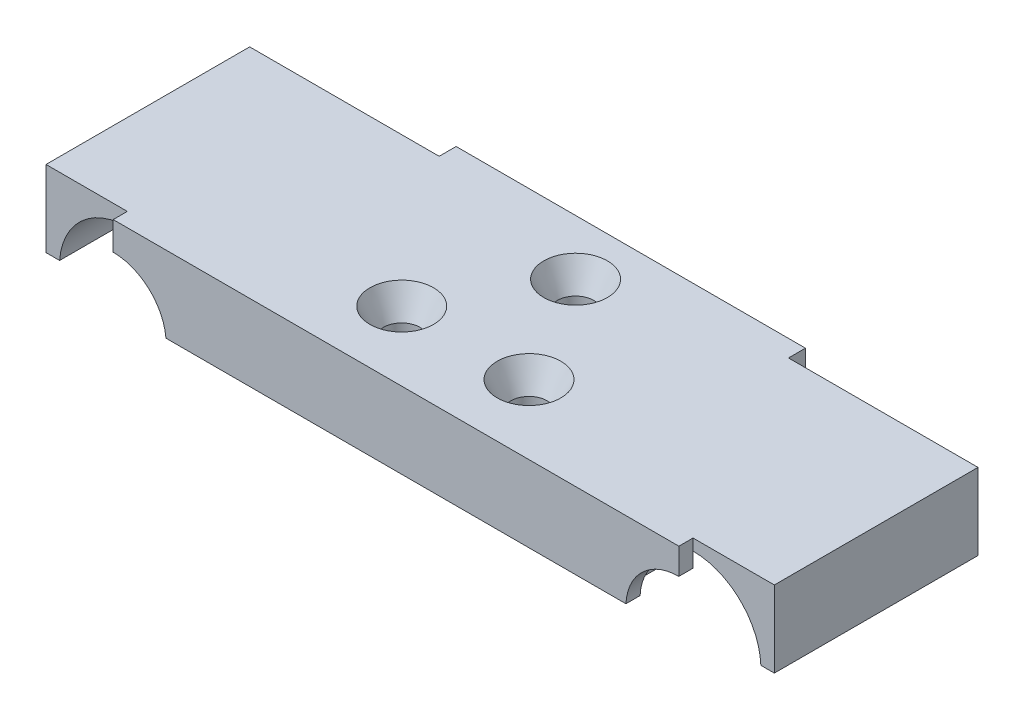
ISO-10303-21;
HEADER;
FILE_DESCRIPTION(('STEP AP214'),'2;1');
FILE_NAME('part.step','',(''),(''),'','','');
FILE_SCHEMA(('AUTOMOTIVE_DESIGN { 1 0 10303 214 1 1 1 1 }'));
ENDSEC;
DATA;
#1=APPLICATION_CONTEXT('core data for automotive mechanical design processes');
#2=APPLICATION_PROTOCOL_DEFINITION('international standard','automotive_design',2000,#1);
#3=PRODUCT_CONTEXT('',#1,'mechanical');
#4=PRODUCT('Part','Part','',(#3));
#5=PRODUCT_RELATED_PRODUCT_CATEGORY('part','',(#4));
#6=PRODUCT_DEFINITION_FORMATION('','',#4);
#7=PRODUCT_DEFINITION_CONTEXT('part definition',#1,'design');
#8=PRODUCT_DEFINITION('design','',#6,#7);
#9=PRODUCT_DEFINITION_SHAPE('','',#8);
#10=(LENGTH_UNIT() NAMED_UNIT(*) SI_UNIT(.MILLI.,.METRE.));
#11=(NAMED_UNIT(*) PLANE_ANGLE_UNIT() SI_UNIT($,.RADIAN.));
#12=(NAMED_UNIT(*) SI_UNIT($,.STERADIAN.) SOLID_ANGLE_UNIT());
#13=UNCERTAINTY_MEASURE_WITH_UNIT(LENGTH_MEASURE(1.E-05),#10,'distance_accuracy_value','');
#14=(GEOMETRIC_REPRESENTATION_CONTEXT(3) GLOBAL_UNCERTAINTY_ASSIGNED_CONTEXT((#13)) GLOBAL_UNIT_ASSIGNED_CONTEXT((#10,
#11,#12)) REPRESENTATION_CONTEXT('',''));
#15=CARTESIAN_POINT('',(0.,0.,0.));
#16=DIRECTION('',(0.,0.,1.));
#17=DIRECTION('',(1.,0.,0.));
#18=AXIS2_PLACEMENT_3D('',#15,#16,#17);
#19=CARTESIAN_POINT('',(32.7025,7.112,0.));
#20=DIRECTION('',(0.,0.,-1.));
#21=DIRECTION('',(-1.,0.,0.));
#22=AXIS2_PLACEMENT_3D('',#19,#20,#21);
#23=PLANE('',#22);
#24=DIRECTION('',(0.,-1.,0.));
#25=VECTOR('',#24,1.);
#26=CARTESIAN_POINT('',(-32.7025,7.112,0.));
#27=LINE('',#26,#25);
#28=CARTESIAN_POINT('',(-32.7025,7.112,0.));
#29=VERTEX_POINT('',#28);
#30=CARTESIAN_POINT('',(-32.7025,0.254,0.));
#31=VERTEX_POINT('',#30);
#32=EDGE_CURVE('E231',#29,#31,#27,.T.);
#33=ORIENTED_EDGE('',*,*,#32,.T.);
#34=DIRECTION('',(1.,0.,0.));
#35=VECTOR('',#34,1.);
#36=CARTESIAN_POINT('',(32.7025,0.254,0.));
#37=LINE('',#36,#35);
#38=CARTESIAN_POINT('',(-31.4797726725594,0.254,0.));
#39=VERTEX_POINT('',#38);
#40=EDGE_CURVE('E281',#31,#39,#37,.T.);
#41=ORIENTED_EDGE('',*,*,#40,.T.);
#42=CARTESIAN_POINT('',(-25.4,-0.190499999999999,0.));
#43=DIRECTION('',(0.,0.,1.));
#44=DIRECTION('',(1.,0.,0.));
#45=AXIS2_PLACEMENT_3D('',#42,#43,#44);
#46=CIRCLE('',#45,6.096);
#47=CARTESIAN_POINT('',(-25.4,5.9055,0.));
#48=VERTEX_POINT('',#47);
#49=EDGE_CURVE('E401',#48,#39,#46,.T.);
#50=ORIENTED_EDGE('',*,*,#49,.F.);
#51=DIRECTION('',(0.,-1.,0.));
#52=VECTOR('',#51,1.);
#53=CARTESIAN_POINT('',(-25.4,4.572,0.));
#54=LINE('',#53,#52);
#55=CARTESIAN_POINT('',(-25.4,7.112,0.));
#56=VERTEX_POINT('',#55);
#57=EDGE_CURVE('E365',#56,#48,#54,.T.);
#58=ORIENTED_EDGE('',*,*,#57,.F.);
#59=DIRECTION('',(1.,0.,0.));
#60=VECTOR('',#59,1.);
#61=CARTESIAN_POINT('',(32.7025,7.112,0.));
#62=LINE('',#61,#60);
#63=EDGE_CURVE('E243',#29,#56,#62,.T.);
#64=ORIENTED_EDGE('',*,*,#63,.F.);
#65=EDGE_LOOP('',(#33,#41,#50,#58,#64));
#66=FACE_BOUND('',#65,.T.);
#67=ADVANCED_FACE('F32',(#66),#23,.F.);
#68=CARTESIAN_POINT('',(25.3996428112442,0.,0.));
#69=DIRECTION('',(0.,0.,1.));
#70=DIRECTION('',(1.,0.,0.));
#71=AXIS2_PLACEMENT_3D('',#68,#69,#70);
#72=CIRCLE('',#71,6.096);
#73=CARTESIAN_POINT('',(31.4903488458514,0.254,0.));
#74=VERTEX_POINT('',#73);
#75=CARTESIAN_POINT('',(25.3996428112442,6.096,0.));
#76=VERTEX_POINT('',#75);
#77=EDGE_CURVE('E349',#74,#76,#72,.T.);
#78=ORIENTED_EDGE('',*,*,#77,.F.);
#79=DIRECTION('',(1.,0.,0.));
#80=VECTOR('',#79,1.);
#81=CARTESIAN_POINT('',(32.7025,0.254,0.));
#82=LINE('',#81,#80);
#83=CARTESIAN_POINT('',(32.7025,0.254,0.));
#84=VERTEX_POINT('',#83);
#85=EDGE_CURVE('E348',#74,#84,#82,.T.);
#86=ORIENTED_EDGE('',*,*,#85,.T.);
#87=DIRECTION('',(0.,-1.,0.));
#88=VECTOR('',#87,1.);
#89=CARTESIAN_POINT('',(32.7025,7.112,0.));
#90=LINE('',#89,#88);
#91=CARTESIAN_POINT('',(32.7025,7.112,0.));
#92=VERTEX_POINT('',#91);
#93=EDGE_CURVE('E228',#92,#84,#90,.T.);
#94=ORIENTED_EDGE('',*,*,#93,.F.);
#95=CARTESIAN_POINT('',(25.3996428112442,7.112,0.));
#96=VERTEX_POINT('',#95);
#97=EDGE_CURVE('E248',#96,#92,#62,.T.);
#98=ORIENTED_EDGE('',*,*,#97,.F.);
#99=DIRECTION('',(0.,1.,0.));
#100=VECTOR('',#99,1.);
#101=CARTESIAN_POINT('',(25.3996428112442,4.7625,0.));
#102=LINE('',#101,#100);
#103=EDGE_CURVE('E42',#76,#96,#102,.T.);
#104=ORIENTED_EDGE('',*,*,#103,.F.);
#105=EDGE_LOOP('',(#78,#86,#94,#98,#104));
#106=FACE_BOUND('',#105,.T.);
#107=ADVANCED_FACE('F347',(#106),#23,.F.);
#108=CARTESIAN_POINT('',(25.3996428112442,0.,-19.812));
#109=DIRECTION('',(0.,0.,1.));
#110=DIRECTION('',(1.,0.,0.));
#111=AXIS2_PLACEMENT_3D('',#108,#109,#110);
#112=CYLINDRICAL_SURFACE('',#111,4.7625);
#113=CARTESIAN_POINT('',(25.3996428112442,0.,-10.668));
#114=DIRECTION('',(0.,0.,1.));
#115=DIRECTION('',(1.,0.,0.));
#116=AXIS2_PLACEMENT_3D('',#113,#114,#115);
#117=CIRCLE('',#116,4.7625);
#118=CARTESIAN_POINT('',(20.6439209680326,0.254,-10.668));
#119=VERTEX_POINT('',#118);
#120=CARTESIAN_POINT('',(30.1553646544558,0.254,-10.668));
#121=VERTEX_POINT('',#120);
#122=EDGE_CURVE('E240',#119,#121,#117,.F.);
#123=ORIENTED_EDGE('',*,*,#122,.F.);
#124=DIRECTION('',(0.,0.,1.));
#125=VECTOR('',#124,1.);
#126=CARTESIAN_POINT('',(20.6439209680326,0.254,-19.812));
#127=LINE('',#126,#125);
#128=CARTESIAN_POINT('',(20.6439209680326,0.254,-18.288));
#129=VERTEX_POINT('',#128);
#130=EDGE_CURVE('E289',#119,#129,#127,.F.);
#131=ORIENTED_EDGE('',*,*,#130,.T.);
#132=CARTESIAN_POINT('',(25.3996428112442,0.,-18.288));
#133=DIRECTION('',(0.,0.,1.));
#134=DIRECTION('',(1.,0.,0.));
#135=AXIS2_PLACEMENT_3D('',#132,#133,#134);
#136=CIRCLE('',#135,4.7625);
#137=CARTESIAN_POINT('',(30.1553646544558,0.254,-18.288));
#138=VERTEX_POINT('',#137);
#139=EDGE_CURVE('E234',#138,#129,#136,.T.);
#140=ORIENTED_EDGE('',*,*,#139,.F.);
#141=DIRECTION('',(0.,0.,1.));
#142=VECTOR('',#141,1.);
#143=CARTESIAN_POINT('',(30.1553646544558,0.254,-19.812));
#144=LINE('',#143,#142);
#145=EDGE_CURVE('E350',#138,#121,#144,.T.);
#146=ORIENTED_EDGE('',*,*,#145,.T.);
#147=EDGE_LOOP('',(#123,#131,#140,#146));
#148=FACE_BOUND('',#147,.T.);
#149=ADVANCED_FACE('F433',(#148),#112,.F.);
#150=CARTESIAN_POINT('',(-25.4,-0.190499999999999,-19.812));
#151=DIRECTION('',(0.,0.,1.));
#152=DIRECTION('',(1.,0.,0.));
#153=AXIS2_PLACEMENT_3D('',#150,#151,#152);
#154=CYLINDRICAL_SURFACE('',#153,4.7625);
#155=CARTESIAN_POINT('',(-25.4,-0.190499999999999,-10.668));
#156=DIRECTION('',(0.,0.,1.));
#157=DIRECTION('',(1.,0.,0.));
#158=AXIS2_PLACEMENT_3D('',#155,#156,#157);
#159=CIRCLE('',#158,4.7625);
#160=CARTESIAN_POINT('',(-30.141711294459,0.254,-10.668));
#161=VERTEX_POINT('',#160);
#162=CARTESIAN_POINT('',(-20.658288705541,0.254,-10.668));
#163=VERTEX_POINT('',#162);
#164=EDGE_CURVE('E237',#161,#163,#159,.F.);
#165=ORIENTED_EDGE('',*,*,#164,.F.);
#166=DIRECTION('',(0.,0.,1.));
#167=VECTOR('',#166,1.);
#168=CARTESIAN_POINT('',(-30.141711294459,0.254,-19.812));
#169=LINE('',#168,#167);
#170=CARTESIAN_POINT('',(-30.141711294459,0.254,-18.288));
#171=VERTEX_POINT('',#170);
#172=EDGE_CURVE('E49',#161,#171,#169,.F.);
#173=ORIENTED_EDGE('',*,*,#172,.T.);
#174=CARTESIAN_POINT('',(-25.4,-0.190499999999999,-18.288));
#175=DIRECTION('',(0.,0.,1.));
#176=DIRECTION('',(1.,0.,0.));
#177=AXIS2_PLACEMENT_3D('',#174,#175,#176);
#178=CIRCLE('',#177,4.7625);
#179=CARTESIAN_POINT('',(-20.658288705541,0.254,-18.288));
#180=VERTEX_POINT('',#179);
#181=EDGE_CURVE('E279',#180,#171,#178,.T.);
#182=ORIENTED_EDGE('',*,*,#181,.F.);
#183=DIRECTION('',(0.,0.,1.));
#184=VECTOR('',#183,1.);
#185=CARTESIAN_POINT('',(-20.658288705541,0.254,-19.812));
#186=LINE('',#185,#184);
#187=EDGE_CURVE('E291',#180,#163,#186,.T.);
#188=ORIENTED_EDGE('',*,*,#187,.T.);
#189=EDGE_LOOP('',(#165,#173,#182,#188));
#190=FACE_BOUND('',#189,.T.);
#191=ADVANCED_FACE('F431',(#190),#154,.F.);
#192=CARTESIAN_POINT('',(-32.7025,7.112,0.));
#193=DIRECTION('',(1.,0.,0.));
#194=DIRECTION('',(0.,0.,-1.));
#195=AXIS2_PLACEMENT_3D('',#192,#193,#194);
#196=PLANE('',#195);
#197=DIRECTION('',(0.,-1.,0.));
#198=VECTOR('',#197,1.);
#199=CARTESIAN_POINT('',(-32.7025,7.112,-18.288));
#200=LINE('',#199,#198);
#201=CARTESIAN_POINT('',(-32.7025,7.112,-18.288));
#202=VERTEX_POINT('',#201);
#203=CARTESIAN_POINT('',(-32.7025,0.254,-18.288));
#204=VERTEX_POINT('',#203);
#205=EDGE_CURVE('E219',#202,#204,#200,.T.);
#206=ORIENTED_EDGE('',*,*,#205,.T.);
#207=DIRECTION('',(0.,0.,-1.));
#208=VECTOR('',#207,1.);
#209=CARTESIAN_POINT('',(-32.7025,0.254,1.270025));
#210=LINE('',#209,#208);
#211=EDGE_CURVE('E211',#31,#204,#210,.T.);
#212=ORIENTED_EDGE('',*,*,#211,.F.);
#213=ORIENTED_EDGE('',*,*,#32,.F.);
#214=DIRECTION('',(0.,0.,1.));
#215=VECTOR('',#214,1.);
#216=CARTESIAN_POINT('',(-32.7025,7.112,0.));
#217=LINE('',#216,#215);
#218=EDGE_CURVE('E253',#202,#29,#217,.T.);
#219=ORIENTED_EDGE('',*,*,#218,.F.);
#220=EDGE_LOOP('',(#206,#212,#213,#219));
#221=FACE_BOUND('',#220,.T.);
#222=ADVANCED_FACE('F34',(#221),#196,.F.);
#223=CARTESIAN_POINT('',(32.7025,7.112,-18.288));
#224=DIRECTION('',(-1.,0.,0.));
#225=DIRECTION('',(0.,0.,1.));
#226=AXIS2_PLACEMENT_3D('',#223,#224,#225);
#227=PLANE('',#226);
#228=ORIENTED_EDGE('',*,*,#93,.T.);
#229=DIRECTION('',(0.,0.,-1.));
#230=VECTOR('',#229,1.);
#231=CARTESIAN_POINT('',(32.7025,0.254,1.270025));
#232=LINE('',#231,#230);
#233=CARTESIAN_POINT('',(32.7025,0.254,-18.288));
#234=VERTEX_POINT('',#233);
#235=EDGE_CURVE('E320',#84,#234,#232,.T.);
#236=ORIENTED_EDGE('',*,*,#235,.T.);
#237=DIRECTION('',(0.,-1.,0.));
#238=VECTOR('',#237,1.);
#239=CARTESIAN_POINT('',(32.7025,7.112,-18.288));
#240=LINE('',#239,#238);
#241=CARTESIAN_POINT('',(32.7025,7.112,-18.288));
#242=VERTEX_POINT('',#241);
#243=EDGE_CURVE('E225',#242,#234,#240,.T.);
#244=ORIENTED_EDGE('',*,*,#243,.F.);
#245=DIRECTION('',(0.,0.,-1.));
#246=VECTOR('',#245,1.);
#247=CARTESIAN_POINT('',(32.7025,7.112,-18.288));
#248=LINE('',#247,#246);
#249=EDGE_CURVE('E247',#92,#242,#248,.T.);
#250=ORIENTED_EDGE('',*,*,#249,.F.);
#251=EDGE_LOOP('',(#228,#236,#244,#250));
#252=FACE_BOUND('',#251,.T.);
#253=ADVANCED_FACE('F325',(#252),#227,.F.);
#254=CARTESIAN_POINT('',(15.6845,7.112,-18.288));
#255=DIRECTION('',(0.,0.,1.));
#256=DIRECTION('',(1.,0.,0.));
#257=AXIS2_PLACEMENT_3D('',#254,#255,#256);
#258=PLANE('',#257);
#259=ORIENTED_EDGE('',*,*,#243,.T.);
#260=DIRECTION('',(-1.,0.,0.));
#261=VECTOR('',#260,1.);
#262=CARTESIAN_POINT('',(15.6845,0.254,-18.288));
#263=LINE('',#262,#261);
#264=EDGE_CURVE('E333',#234,#138,#263,.T.);
#265=ORIENTED_EDGE('',*,*,#264,.T.);
#266=ORIENTED_EDGE('',*,*,#139,.T.);
#267=CARTESIAN_POINT('',(15.6845,0.254,-18.288));
#268=VERTEX_POINT('',#267);
#269=EDGE_CURVE('E200',#129,#268,#263,.T.);
#270=ORIENTED_EDGE('',*,*,#269,.T.);
#271=DIRECTION('',(0.,-1.,0.));
#272=VECTOR('',#271,1.);
#273=CARTESIAN_POINT('',(15.6845,7.112,-18.288));
#274=LINE('',#273,#272);
#275=CARTESIAN_POINT('',(15.6845,7.112,-18.288));
#276=VERTEX_POINT('',#275);
#277=EDGE_CURVE('E217',#276,#268,#274,.T.);
#278=ORIENTED_EDGE('',*,*,#277,.F.);
#279=DIRECTION('',(-1.,0.,0.));
#280=VECTOR('',#279,1.);
#281=CARTESIAN_POINT('',(15.6845,7.112,-18.288));
#282=LINE('',#281,#280);
#283=EDGE_CURVE('E257',#242,#276,#282,.T.);
#284=ORIENTED_EDGE('',*,*,#283,.F.);
#285=EDGE_LOOP('',(#259,#265,#266,#270,#278,#284));
#286=FACE_BOUND('',#285,.T.);
#287=ADVANCED_FACE('F332',(#286),#258,.F.);
#288=CARTESIAN_POINT('',(15.6845,7.112,-19.812));
#289=DIRECTION('',(-1.,0.,0.));
#290=DIRECTION('',(0.,0.,1.));
#291=AXIS2_PLACEMENT_3D('',#288,#289,#290);
#292=PLANE('',#291);
#293=ORIENTED_EDGE('',*,*,#277,.T.);
#294=DIRECTION('',(0.,0.,-1.));
#295=VECTOR('',#294,1.);
#296=CARTESIAN_POINT('',(15.6845,0.254,-19.812));
#297=LINE('',#296,#295);
#298=CARTESIAN_POINT('',(15.6845,0.254,-19.812));
#299=VERTEX_POINT('',#298);
#300=EDGE_CURVE('E524',#268,#299,#297,.T.);
#301=ORIENTED_EDGE('',*,*,#300,.T.);
#302=DIRECTION('',(0.,-1.,0.));
#303=VECTOR('',#302,1.);
#304=CARTESIAN_POINT('',(15.6845,7.112,-19.812));
#305=LINE('',#304,#303);
#306=CARTESIAN_POINT('',(15.6845,7.112,-19.812));
#307=VERTEX_POINT('',#306);
#308=EDGE_CURVE('E210',#307,#299,#305,.T.);
#309=ORIENTED_EDGE('',*,*,#308,.F.);
#310=DIRECTION('',(0.,0.,-1.));
#311=VECTOR('',#310,1.);
#312=CARTESIAN_POINT('',(15.6845,7.112,-19.812));
#313=LINE('',#312,#311);
#314=EDGE_CURVE('E259',#276,#307,#313,.T.);
#315=ORIENTED_EDGE('',*,*,#314,.F.);
#316=EDGE_LOOP('',(#293,#301,#309,#315));
#317=FACE_BOUND('',#316,.T.);
#318=ADVANCED_FACE('F450',(#317),#292,.F.);
#319=CARTESIAN_POINT('',(-15.6845,7.112,-19.812));
#320=DIRECTION('',(0.,0.,1.));
#321=DIRECTION('',(1.,0.,0.));
#322=AXIS2_PLACEMENT_3D('',#319,#320,#321);
#323=PLANE('',#322);
#324=ORIENTED_EDGE('',*,*,#308,.T.);
#325=DIRECTION('',(1.,0.,0.));
#326=VECTOR('',#325,1.);
#327=CARTESIAN_POINT('',(32.7025,0.254,-19.812));
#328=LINE('',#327,#326);
#329=CARTESIAN_POINT('',(-15.6845,0.254,-19.812));
#330=VERTEX_POINT('',#329);
#331=EDGE_CURVE('E192',#330,#299,#328,.T.);
#332=ORIENTED_EDGE('',*,*,#331,.F.);
#333=DIRECTION('',(0.,-1.,0.));
#334=VECTOR('',#333,1.);
#335=CARTESIAN_POINT('',(-15.6845,7.112,-19.812));
#336=LINE('',#335,#334);
#337=CARTESIAN_POINT('',(-15.6845,7.112,-19.812));
#338=VERTEX_POINT('',#337);
#339=EDGE_CURVE('E207',#338,#330,#336,.T.);
#340=ORIENTED_EDGE('',*,*,#339,.F.);
#341=DIRECTION('',(-1.,0.,0.));
#342=VECTOR('',#341,1.);
#343=CARTESIAN_POINT('',(-15.6845,7.112,-19.812));
#344=LINE('',#343,#342);
#345=EDGE_CURVE('E261',#307,#338,#344,.T.);
#346=ORIENTED_EDGE('',*,*,#345,.F.);
#347=EDGE_LOOP('',(#324,#332,#340,#346));
#348=FACE_BOUND('',#347,.T.);
#349=ADVANCED_FACE('F205',(#348),#323,.F.);
#350=CARTESIAN_POINT('',(-15.6845,7.112,-18.288));
#351=DIRECTION('',(1.,0.,0.));
#352=DIRECTION('',(0.,0.,-1.));
#353=AXIS2_PLACEMENT_3D('',#350,#351,#352);
#354=PLANE('',#353);
#355=ORIENTED_EDGE('',*,*,#339,.T.);
#356=DIRECTION('',(0.,0.,1.));
#357=VECTOR('',#356,1.);
#358=CARTESIAN_POINT('',(-15.6845,0.254,-18.288));
#359=LINE('',#358,#357);
#360=CARTESIAN_POINT('',(-15.6845,0.254,-18.288));
#361=VERTEX_POINT('',#360);
#362=EDGE_CURVE('E188',#330,#361,#359,.T.);
#363=ORIENTED_EDGE('',*,*,#362,.T.);
#364=DIRECTION('',(0.,-1.,0.));
#365=VECTOR('',#364,1.);
#366=CARTESIAN_POINT('',(-15.6845,7.112,-18.288));
#367=LINE('',#366,#365);
#368=CARTESIAN_POINT('',(-15.6845,7.112,-18.288));
#369=VERTEX_POINT('',#368);
#370=EDGE_CURVE('E215',#369,#361,#367,.T.);
#371=ORIENTED_EDGE('',*,*,#370,.F.);
#372=DIRECTION('',(0.,0.,1.));
#373=VECTOR('',#372,1.);
#374=CARTESIAN_POINT('',(-15.6845,7.112,-18.288));
#375=LINE('',#374,#373);
#376=EDGE_CURVE('E214',#338,#369,#375,.T.);
#377=ORIENTED_EDGE('',*,*,#376,.F.);
#378=EDGE_LOOP('',(#355,#363,#371,#377));
#379=FACE_BOUND('',#378,.T.);
#380=ADVANCED_FACE('F213',(#379),#354,.F.);
#381=CARTESIAN_POINT('',(-32.7025,7.112,-18.288));
#382=DIRECTION('',(0.,0.,1.));
#383=DIRECTION('',(1.,0.,0.));
#384=AXIS2_PLACEMENT_3D('',#381,#382,#383);
#385=PLANE('',#384);
#386=ORIENTED_EDGE('',*,*,#370,.T.);
#387=DIRECTION('',(-1.,0.,0.));
#388=VECTOR('',#387,1.);
#389=CARTESIAN_POINT('',(-32.7025,0.254,-18.288));
#390=LINE('',#389,#388);
#391=EDGE_CURVE('E195',#361,#180,#390,.T.);
#392=ORIENTED_EDGE('',*,*,#391,.T.);
#393=ORIENTED_EDGE('',*,*,#181,.T.);
#394=EDGE_CURVE('E277',#171,#204,#390,.T.);
#395=ORIENTED_EDGE('',*,*,#394,.T.);
#396=ORIENTED_EDGE('',*,*,#205,.F.);
#397=DIRECTION('',(-1.,0.,0.));
#398=VECTOR('',#397,1.);
#399=CARTESIAN_POINT('',(-32.7025,7.112,-18.288));
#400=LINE('',#399,#398);
#401=EDGE_CURVE('E264',#369,#202,#400,.T.);
#402=ORIENTED_EDGE('',*,*,#401,.F.);
#403=EDGE_LOOP('',(#386,#392,#393,#395,#396,#402));
#404=FACE_BOUND('',#403,.T.);
#405=ADVANCED_FACE('F275',(#404),#385,.F.);
#406=CARTESIAN_POINT('',(0.,7.112,0.));
#407=DIRECTION('',(0.,-1.,0.));
#408=DIRECTION('',(0.,0.,-1.));
#409=AXIS2_PLACEMENT_3D('',#406,#407,#408);
#410=PLANE('',#409);
#411=CARTESIAN_POINT('',(0.,7.112,-14.8553351826281));
#412=DIRECTION('',(0.,1.,0.));
#413=DIRECTION('',(0.,0.,1.));
#414=AXIS2_PLACEMENT_3D('',#411,#412,#413);
#415=CIRCLE('',#414,2.8575);
#416=CARTESIAN_POINT('',(0.,7.112,-11.9978351826281));
#417=VERTEX_POINT('',#416);
#418=EDGE_CURVE('E468',#417,#417,#415,.T.);
#419=ORIENTED_EDGE('',*,*,#418,.F.);
#420=EDGE_LOOP('',(#419));
#421=FACE_BOUND('',#420,.T.);
#422=CARTESIAN_POINT('',(-5.715,7.112,-4.95666481737192));
#423=DIRECTION('',(0.,1.,0.));
#424=DIRECTION('',(0.,0.,1.));
#425=AXIS2_PLACEMENT_3D('',#422,#423,#424);
#426=CIRCLE('',#425,2.8575);
#427=CARTESIAN_POINT('',(-5.715,7.112,-2.09916481737192));
#428=VERTEX_POINT('',#427);
#429=EDGE_CURVE('E472',#428,#428,#426,.T.);
#430=ORIENTED_EDGE('',*,*,#429,.F.);
#431=EDGE_LOOP('',(#430));
#432=FACE_BOUND('',#431,.T.);
#433=CARTESIAN_POINT('',(5.715,7.112,-4.95666481737193));
#434=DIRECTION('',(0.,1.,0.));
#435=DIRECTION('',(0.,0.,1.));
#436=AXIS2_PLACEMENT_3D('',#433,#434,#435);
#437=CIRCLE('',#436,2.8575);
#438=CARTESIAN_POINT('',(5.715,7.112,-2.09916481737193));
#439=VERTEX_POINT('',#438);
#440=EDGE_CURVE('E475',#439,#439,#437,.T.);
#441=ORIENTED_EDGE('',*,*,#440,.F.);
#442=EDGE_LOOP('',(#441));
#443=FACE_BOUND('',#442,.T.);
#444=ORIENTED_EDGE('',*,*,#218,.T.);
#445=ORIENTED_EDGE('',*,*,#63,.T.);
#446=DIRECTION('',(0.,0.,-1.));
#447=VECTOR('',#446,1.);
#448=CARTESIAN_POINT('',(-25.4,7.11199999999999,1.27));
#449=LINE('',#448,#447);
#450=CARTESIAN_POINT('',(-25.4,7.11199999999999,1.27));
#451=VERTEX_POINT('',#450);
#452=EDGE_CURVE('E385',#451,#56,#449,.T.);
#453=ORIENTED_EDGE('',*,*,#452,.F.);
#454=DIRECTION('',(-1.,0.,0.));
#455=VECTOR('',#454,1.);
#456=CARTESIAN_POINT('',(25.3996428112442,7.112,1.27));
#457=LINE('',#456,#455);
#458=CARTESIAN_POINT('',(25.3996428112442,7.112,1.27));
#459=VERTEX_POINT('',#458);
#460=EDGE_CURVE('E369',#459,#451,#457,.T.);
#461=ORIENTED_EDGE('',*,*,#460,.F.);
#462=DIRECTION('',(0.,0.,-1.));
#463=VECTOR('',#462,1.);
#464=CARTESIAN_POINT('',(25.3996428112442,7.112,1.27));
#465=LINE('',#464,#463);
#466=EDGE_CURVE('E342',#459,#96,#465,.T.);
#467=ORIENTED_EDGE('',*,*,#466,.T.);
#468=ORIENTED_EDGE('',*,*,#97,.T.);
#469=ORIENTED_EDGE('',*,*,#249,.T.);
#470=ORIENTED_EDGE('',*,*,#283,.T.);
#471=ORIENTED_EDGE('',*,*,#314,.T.);
#472=ORIENTED_EDGE('',*,*,#345,.T.);
#473=ORIENTED_EDGE('',*,*,#376,.T.);
#474=ORIENTED_EDGE('',*,*,#401,.T.);
#475=EDGE_LOOP('',(#444,#445,#453,#461,#467,#468,#469,#470,#471,#472,#473,#474));
#476=FACE_BOUND('',#475,.T.);
#477=ADVANCED_FACE('F338',(#421,#432,#443,#476),#410,.F.);
#478=CARTESIAN_POINT('',(-25.4,-0.190499999999999,-10.668));
#479=DIRECTION('',(0.,0.,1.));
#480=DIRECTION('',(1.,0.,0.));
#481=AXIS2_PLACEMENT_3D('',#478,#479,#480);
#482=CYLINDRICAL_SURFACE('',#481,6.096);
#483=ORIENTED_EDGE('',*,*,#49,.T.);
#484=DIRECTION('',(0.,0.,1.));
#485=VECTOR('',#484,1.);
#486=CARTESIAN_POINT('',(-31.4797726725594,0.254,-10.668));
#487=LINE('',#486,#485);
#488=CARTESIAN_POINT('',(-31.4797726725594,0.254,-10.668));
#489=VERTEX_POINT('',#488);
#490=EDGE_CURVE('E357',#39,#489,#487,.F.);
#491=ORIENTED_EDGE('',*,*,#490,.T.);
#492=CARTESIAN_POINT('',(-25.4,-0.190499999999999,-10.668));
#493=DIRECTION('',(0.,0.,1.));
#494=DIRECTION('',(1.,0.,0.));
#495=AXIS2_PLACEMENT_3D('',#492,#493,#494);
#496=CIRCLE('',#495,6.096);
#497=CARTESIAN_POINT('',(-19.3202273274406,0.254,-10.668));
#498=VERTEX_POINT('',#497);
#499=EDGE_CURVE('E399',#498,#489,#496,.T.);
#500=ORIENTED_EDGE('',*,*,#499,.F.);
#501=DIRECTION('',(0.,0.,1.));
#502=VECTOR('',#501,1.);
#503=CARTESIAN_POINT('',(-19.3202273274406,0.254,-10.668));
#504=LINE('',#503,#502);
#505=CARTESIAN_POINT('',(-19.3202273274406,0.254,0.));
#506=VERTEX_POINT('',#505);
#507=EDGE_CURVE('E303',#498,#506,#504,.T.);
#508=ORIENTED_EDGE('',*,*,#507,.T.);
#509=EDGE_CURVE('E36',#506,#48,#46,.T.);
#510=ORIENTED_EDGE('',*,*,#509,.T.);
#511=EDGE_LOOP('',(#483,#491,#500,#508,#510));
#512=FACE_BOUND('',#511,.T.);
#513=ADVANCED_FACE('F426',(#512),#482,.F.);
#514=CARTESIAN_POINT('',(-25.4,-0.190499999999999,-10.668));
#515=DIRECTION('',(0.,0.,1.));
#516=DIRECTION('',(1.,0.,0.));
#517=AXIS2_PLACEMENT_3D('',#514,#515,#516);
#518=PLANE('',#517);
#519=DIRECTION('',(-1.,0.,0.));
#520=VECTOR('',#519,1.);
#521=CARTESIAN_POINT('',(-25.4,0.254,-10.668));
#522=LINE('',#521,#520);
#523=EDGE_CURVE('E296',#498,#163,#522,.T.);
#524=ORIENTED_EDGE('',*,*,#523,.F.);
#525=ORIENTED_EDGE('',*,*,#499,.T.);
#526=EDGE_CURVE('E301',#161,#489,#522,.T.);
#527=ORIENTED_EDGE('',*,*,#526,.F.);
#528=ORIENTED_EDGE('',*,*,#164,.T.);
#529=EDGE_LOOP('',(#524,#525,#527,#528));
#530=FACE_BOUND('',#529,.T.);
#531=ADVANCED_FACE('F428',(#530),#518,.T.);
#532=CARTESIAN_POINT('',(25.3996428112442,0.,-10.668));
#533=DIRECTION('',(0.,0.,1.));
#534=DIRECTION('',(1.,0.,0.));
#535=AXIS2_PLACEMENT_3D('',#532,#533,#534);
#536=CYLINDRICAL_SURFACE('',#535,6.096);
#537=CARTESIAN_POINT('',(19.3089367766371,0.254,0.));
#538=VERTEX_POINT('',#537);
#539=EDGE_CURVE('E388',#76,#538,#72,.T.);
#540=ORIENTED_EDGE('',*,*,#539,.T.);
#541=DIRECTION('',(0.,0.,1.));
#542=VECTOR('',#541,1.);
#543=CARTESIAN_POINT('',(19.3089367766371,0.254,-10.668));
#544=LINE('',#543,#542);
#545=CARTESIAN_POINT('',(19.3089367766371,0.254,-10.668));
#546=VERTEX_POINT('',#545);
#547=EDGE_CURVE('E307',#538,#546,#544,.F.);
#548=ORIENTED_EDGE('',*,*,#547,.T.);
#549=CARTESIAN_POINT('',(25.3996428112442,0.,-10.668));
#550=DIRECTION('',(0.,0.,1.));
#551=DIRECTION('',(1.,0.,0.));
#552=AXIS2_PLACEMENT_3D('',#549,#550,#551);
#553=CIRCLE('',#552,6.096);
#554=CARTESIAN_POINT('',(31.4903488458514,0.254,-10.668));
#555=VERTEX_POINT('',#554);
#556=EDGE_CURVE('E397',#555,#546,#553,.T.);
#557=ORIENTED_EDGE('',*,*,#556,.F.);
#558=DIRECTION('',(0.,0.,1.));
#559=VECTOR('',#558,1.);
#560=CARTESIAN_POINT('',(31.4903488458514,0.254,-10.668));
#561=LINE('',#560,#559);
#562=EDGE_CURVE('E57',#555,#74,#561,.T.);
#563=ORIENTED_EDGE('',*,*,#562,.T.);
#564=ORIENTED_EDGE('',*,*,#77,.T.);
#565=EDGE_LOOP('',(#540,#548,#557,#563,#564));
#566=FACE_BOUND('',#565,.T.);
#567=ADVANCED_FACE('F502',(#566),#536,.F.);
#568=CARTESIAN_POINT('',(25.3996428112442,0.,-10.668));
#569=DIRECTION('',(0.,0.,1.));
#570=DIRECTION('',(1.,0.,0.));
#571=AXIS2_PLACEMENT_3D('',#568,#569,#570);
#572=PLANE('',#571);
#573=DIRECTION('',(-1.,0.,0.));
#574=VECTOR('',#573,1.);
#575=CARTESIAN_POINT('',(25.3996428112442,0.254,-10.668));
#576=LINE('',#575,#574);
#577=EDGE_CURVE('E304',#555,#121,#576,.T.);
#578=ORIENTED_EDGE('',*,*,#577,.F.);
#579=ORIENTED_EDGE('',*,*,#556,.T.);
#580=EDGE_CURVE('E300',#119,#546,#576,.T.);
#581=ORIENTED_EDGE('',*,*,#580,.F.);
#582=ORIENTED_EDGE('',*,*,#122,.T.);
#583=EDGE_LOOP('',(#578,#579,#581,#582));
#584=FACE_BOUND('',#583,.T.);
#585=ADVANCED_FACE('F510',(#584),#572,.T.);
#586=CARTESIAN_POINT('',(5.715,7.112,-4.95666481737193));
#587=DIRECTION('',(0.,1.,0.));
#588=DIRECTION('',(0.,0.,1.));
#589=AXIS2_PLACEMENT_3D('',#586,#587,#588);
#590=CYLINDRICAL_SURFACE('',#589,1.63195);
#591=CARTESIAN_POINT('',(5.715,0.254,-4.95666481737193));
#592=DIRECTION('',(0.,1.,0.));
#593=DIRECTION('',(0.,0.,1.));
#594=AXIS2_PLACEMENT_3D('',#591,#592,#593);
#595=CIRCLE('',#594,1.63195);
#596=CARTESIAN_POINT('',(5.715,0.254,-3.32471481737193));
#597=VERTEX_POINT('',#596);
#598=EDGE_CURVE('E512',#597,#597,#595,.F.);
#599=ORIENTED_EDGE('',*,*,#598,.T.);
#600=EDGE_LOOP('',(#599));
#601=FACE_BOUND('',#600,.T.);
#602=CARTESIAN_POINT('',(5.715,4.6482,-4.95666481737193));
#603=DIRECTION('',(0.,1.,0.));
#604=DIRECTION('',(0.,0.,1.));
#605=AXIS2_PLACEMENT_3D('',#602,#603,#604);
#606=CIRCLE('',#605,1.63195);
#607=CARTESIAN_POINT('',(5.715,4.6482,-3.32471481737193));
#608=VERTEX_POINT('',#607);
#609=EDGE_CURVE('E392',#608,#608,#606,.T.);
#610=ORIENTED_EDGE('',*,*,#609,.T.);
#611=EDGE_LOOP('',(#610));
#612=FACE_BOUND('',#611,.T.);
#613=ADVANCED_FACE('F625',(#601,#612),#590,.F.);
#614=CARTESIAN_POINT('',(5.715,7.112,-4.95666481737193));
#615=DIRECTION('',(0.,1.,0.));
#616=DIRECTION('',(0.,0.,1.));
#617=AXIS2_PLACEMENT_3D('',#614,#615,#616);
#618=CONICAL_SURFACE('',#617,2.8575,0.461583628443543);
#619=ORIENTED_EDGE('',*,*,#609,.F.);
#620=EDGE_LOOP('',(#619));
#621=FACE_BOUND('',#620,.T.);
#622=ORIENTED_EDGE('',*,*,#440,.T.);
#623=EDGE_LOOP('',(#622));
#624=FACE_BOUND('',#623,.T.);
#625=ADVANCED_FACE('F617',(#621,#624),#618,.F.);
#626=CARTESIAN_POINT('',(-5.715,7.112,-4.95666481737192));
#627=DIRECTION('',(0.,1.,0.));
#628=DIRECTION('',(0.,0.,1.));
#629=AXIS2_PLACEMENT_3D('',#626,#627,#628);
#630=CYLINDRICAL_SURFACE('',#629,1.63195);
#631=CARTESIAN_POINT('',(-5.715,0.254,-4.95666481737192));
#632=DIRECTION('',(0.,1.,0.));
#633=DIRECTION('',(0.,0.,1.));
#634=AXIS2_PLACEMENT_3D('',#631,#632,#633);
#635=CIRCLE('',#634,1.63195);
#636=CARTESIAN_POINT('',(-5.715,0.254,-3.32471481737192));
#637=VERTEX_POINT('',#636);
#638=EDGE_CURVE('E514',#637,#637,#635,.F.);
#639=ORIENTED_EDGE('',*,*,#638,.T.);
#640=EDGE_LOOP('',(#639));
#641=FACE_BOUND('',#640,.T.);
#642=CARTESIAN_POINT('',(-5.715,4.6482,-4.95666481737192));
#643=DIRECTION('',(0.,1.,0.));
#644=DIRECTION('',(0.,0.,1.));
#645=AXIS2_PLACEMENT_3D('',#642,#643,#644);
#646=CIRCLE('',#645,1.63195);
#647=CARTESIAN_POINT('',(-5.715,4.6482,-3.32471481737192));
#648=VERTEX_POINT('',#647);
#649=EDGE_CURVE('E477',#648,#648,#646,.T.);
#650=ORIENTED_EDGE('',*,*,#649,.T.);
#651=EDGE_LOOP('',(#650));
#652=FACE_BOUND('',#651,.T.);
#653=ADVANCED_FACE('F612',(#641,#652),#630,.F.);
#654=CARTESIAN_POINT('',(-5.715,7.112,-4.95666481737192));
#655=DIRECTION('',(0.,1.,0.));
#656=DIRECTION('',(0.,0.,1.));
#657=AXIS2_PLACEMENT_3D('',#654,#655,#656);
#658=CONICAL_SURFACE('',#657,2.8575,0.461583628443542);
#659=ORIENTED_EDGE('',*,*,#649,.F.);
#660=EDGE_LOOP('',(#659));
#661=FACE_BOUND('',#660,.T.);
#662=ORIENTED_EDGE('',*,*,#429,.T.);
#663=EDGE_LOOP('',(#662));
#664=FACE_BOUND('',#663,.T.);
#665=ADVANCED_FACE('F604',(#661,#664),#658,.F.);
#666=CARTESIAN_POINT('',(0.,7.112,-14.8553351826281));
#667=DIRECTION('',(0.,1.,0.));
#668=DIRECTION('',(0.,0.,1.));
#669=AXIS2_PLACEMENT_3D('',#666,#667,#668);
#670=CYLINDRICAL_SURFACE('',#669,1.63195);
#671=CARTESIAN_POINT('',(0.,0.254,-14.8553351826281));
#672=DIRECTION('',(0.,1.,0.));
#673=DIRECTION('',(0.,0.,1.));
#674=AXIS2_PLACEMENT_3D('',#671,#672,#673);
#675=CIRCLE('',#674,1.63195);
#676=CARTESIAN_POINT('',(0.,0.254,-13.2233851826281));
#677=VERTEX_POINT('',#676);
#678=EDGE_CURVE('E519',#677,#677,#675,.F.);
#679=ORIENTED_EDGE('',*,*,#678,.T.);
#680=EDGE_LOOP('',(#679));
#681=FACE_BOUND('',#680,.T.);
#682=CARTESIAN_POINT('',(0.,4.6482,-14.8553351826281));
#683=DIRECTION('',(0.,1.,0.));
#684=DIRECTION('',(0.,0.,1.));
#685=AXIS2_PLACEMENT_3D('',#682,#683,#684);
#686=CIRCLE('',#685,1.63195);
#687=CARTESIAN_POINT('',(0.,4.6482,-13.2233851826281));
#688=VERTEX_POINT('',#687);
#689=EDGE_CURVE('E484',#688,#688,#686,.T.);
#690=ORIENTED_EDGE('',*,*,#689,.T.);
#691=EDGE_LOOP('',(#690));
#692=FACE_BOUND('',#691,.T.);
#693=ADVANCED_FACE('F527',(#681,#692),#670,.F.);
#694=CARTESIAN_POINT('',(0.,7.112,-14.8553351826281));
#695=DIRECTION('',(0.,1.,0.));
#696=DIRECTION('',(0.,0.,1.));
#697=AXIS2_PLACEMENT_3D('',#694,#695,#696);
#698=CONICAL_SURFACE('',#697,2.8575,0.461583628443543);
#699=ORIENTED_EDGE('',*,*,#689,.F.);
#700=EDGE_LOOP('',(#699));
#701=FACE_BOUND('',#700,.T.);
#702=ORIENTED_EDGE('',*,*,#418,.T.);
#703=EDGE_LOOP('',(#702));
#704=FACE_BOUND('',#703,.T.);
#705=ADVANCED_FACE('F594',(#701,#704),#698,.F.);
#706=CARTESIAN_POINT('',(-25.4,-0.190499999999999,0.));
#707=DIRECTION('',(0.,0.,-1.));
#708=DIRECTION('',(-1.,0.,0.));
#709=AXIS2_PLACEMENT_3D('',#706,#707,#708);
#710=PLANE('',#709);
#711=DIRECTION('',(1.,0.,0.));
#712=VECTOR('',#711,1.);
#713=CARTESIAN_POINT('',(-25.4,0.254,0.));
#714=LINE('',#713,#712);
#715=CARTESIAN_POINT('',(20.6439209680326,0.254,0.));
#716=VERTEX_POINT('',#715);
#717=EDGE_CURVE('E310',#538,#716,#714,.T.);
#718=ORIENTED_EDGE('',*,*,#717,.F.);
#719=ORIENTED_EDGE('',*,*,#539,.F.);
#720=CARTESIAN_POINT('',(25.3996428112442,4.7625,0.));
#721=VERTEX_POINT('',#720);
#722=EDGE_CURVE('E375',#721,#76,#102,.T.);
#723=ORIENTED_EDGE('',*,*,#722,.F.);
#724=CARTESIAN_POINT('',(25.3996428112442,0.,0.));
#725=DIRECTION('',(0.,0.,-1.));
#726=DIRECTION('',(-1.,0.,0.));
#727=AXIS2_PLACEMENT_3D('',#724,#725,#726);
#728=CIRCLE('',#727,4.7625);
#729=EDGE_CURVE('E284',#716,#721,#728,.T.);
#730=ORIENTED_EDGE('',*,*,#729,.F.);
#731=EDGE_LOOP('',(#718,#719,#723,#730));
#732=FACE_BOUND('',#731,.T.);
#733=ADVANCED_FACE('F500',(#732),#710,.T.);
#734=DIRECTION('',(1.,0.,0.));
#735=VECTOR('',#734,1.);
#736=CARTESIAN_POINT('',(-25.4,0.254,0.));
#737=LINE('',#736,#735);
#738=CARTESIAN_POINT('',(-20.658288705541,0.254,0.));
#739=VERTEX_POINT('',#738);
#740=EDGE_CURVE('E312',#739,#506,#737,.T.);
#741=ORIENTED_EDGE('',*,*,#740,.F.);
#742=CARTESIAN_POINT('',(-25.4,-0.190499999999999,0.));
#743=DIRECTION('',(0.,0.,-1.));
#744=DIRECTION('',(-1.,0.,0.));
#745=AXIS2_PLACEMENT_3D('',#742,#743,#744);
#746=CIRCLE('',#745,4.7625);
#747=CARTESIAN_POINT('',(-25.4,4.572,0.));
#748=VERTEX_POINT('',#747);
#749=EDGE_CURVE('E280',#748,#739,#746,.T.);
#750=ORIENTED_EDGE('',*,*,#749,.F.);
#751=EDGE_CURVE('E379',#48,#748,#54,.T.);
#752=ORIENTED_EDGE('',*,*,#751,.F.);
#753=ORIENTED_EDGE('',*,*,#509,.F.);
#754=EDGE_LOOP('',(#741,#750,#752,#753));
#755=FACE_BOUND('',#754,.T.);
#756=ADVANCED_FACE('F422',(#755),#710,.T.);
#757=CARTESIAN_POINT('',(-25.4,-0.190499999999999,1.27));
#758=DIRECTION('',(0.,0.,-1.));
#759=DIRECTION('',(-1.,0.,0.));
#760=AXIS2_PLACEMENT_3D('',#757,#758,#759);
#761=CYLINDRICAL_SURFACE('',#760,4.7625);
#762=ORIENTED_EDGE('',*,*,#749,.T.);
#763=DIRECTION('',(0.,0.,-1.));
#764=VECTOR('',#763,1.);
#765=CARTESIAN_POINT('',(-20.658288705541,0.254,1.27));
#766=LINE('',#765,#764);
#767=CARTESIAN_POINT('',(-20.658288705541,0.254,1.27));
#768=VERTEX_POINT('',#767);
#769=EDGE_CURVE('E314',#739,#768,#766,.F.);
#770=ORIENTED_EDGE('',*,*,#769,.T.);
#771=CARTESIAN_POINT('',(-25.4,-0.190499999999999,1.27));
#772=DIRECTION('',(0.,0.,-1.));
#773=DIRECTION('',(-1.,0.,0.));
#774=AXIS2_PLACEMENT_3D('',#771,#772,#773);
#775=CIRCLE('',#774,4.7625);
#776=CARTESIAN_POINT('',(-25.4,4.572,1.27));
#777=VERTEX_POINT('',#776);
#778=EDGE_CURVE('E361',#777,#768,#775,.T.);
#779=ORIENTED_EDGE('',*,*,#778,.F.);
#780=DIRECTION('',(0.,0.,-1.));
#781=VECTOR('',#780,1.);
#782=CARTESIAN_POINT('',(-25.4,4.572,1.27));
#783=LINE('',#782,#781);
#784=EDGE_CURVE('E372',#777,#748,#783,.T.);
#785=ORIENTED_EDGE('',*,*,#784,.T.);
#786=EDGE_LOOP('',(#762,#770,#779,#785));
#787=FACE_BOUND('',#786,.T.);
#788=ADVANCED_FACE('F420',(#787),#761,.F.);
#789=CARTESIAN_POINT('',(25.3996428112442,0.,1.27));
#790=DIRECTION('',(0.,0.,-1.));
#791=DIRECTION('',(-1.,0.,0.));
#792=AXIS2_PLACEMENT_3D('',#789,#790,#791);
#793=CYLINDRICAL_SURFACE('',#792,4.7625);
#794=CARTESIAN_POINT('',(25.3996428112442,0.,1.27));
#795=DIRECTION('',(0.,0.,-1.));
#796=DIRECTION('',(-1.,0.,0.));
#797=AXIS2_PLACEMENT_3D('',#794,#795,#796);
#798=CIRCLE('',#797,4.7625);
#799=CARTESIAN_POINT('',(20.6439209680326,0.254,1.27));
#800=VERTEX_POINT('',#799);
#801=CARTESIAN_POINT('',(25.3996428112442,4.7625,1.27));
#802=VERTEX_POINT('',#801);
#803=EDGE_CURVE('E364',#800,#802,#798,.T.);
#804=ORIENTED_EDGE('',*,*,#803,.F.);
#805=DIRECTION('',(0.,0.,-1.));
#806=VECTOR('',#805,1.);
#807=CARTESIAN_POINT('',(20.6439209680326,0.254,1.27));
#808=LINE('',#807,#806);
#809=EDGE_CURVE('E317',#800,#716,#808,.T.);
#810=ORIENTED_EDGE('',*,*,#809,.T.);
#811=ORIENTED_EDGE('',*,*,#729,.T.);
#812=DIRECTION('',(0.,0.,-1.));
#813=VECTOR('',#812,1.);
#814=CARTESIAN_POINT('',(25.3996428112442,4.7625,1.27));
#815=LINE('',#814,#813);
#816=EDGE_CURVE('E384',#802,#721,#815,.T.);
#817=ORIENTED_EDGE('',*,*,#816,.F.);
#818=EDGE_LOOP('',(#804,#810,#811,#817));
#819=FACE_BOUND('',#818,.T.);
#820=ADVANCED_FACE('F507',(#819),#793,.F.);
#821=CARTESIAN_POINT('',(25.3996428112442,4.7625,1.27));
#822=DIRECTION('',(-1.,0.,0.));
#823=DIRECTION('',(0.,0.,1.));
#824=AXIS2_PLACEMENT_3D('',#821,#822,#823);
#825=PLANE('',#824);
#826=ORIENTED_EDGE('',*,*,#722,.T.);
#827=ORIENTED_EDGE('',*,*,#103,.T.);
#828=ORIENTED_EDGE('',*,*,#466,.F.);
#829=DIRECTION('',(0.,1.,0.));
#830=VECTOR('',#829,1.);
#831=CARTESIAN_POINT('',(25.3996428112442,4.7625,1.27));
#832=LINE('',#831,#830);
#833=EDGE_CURVE('E367',#802,#459,#832,.T.);
#834=ORIENTED_EDGE('',*,*,#833,.F.);
#835=ORIENTED_EDGE('',*,*,#816,.T.);
#836=EDGE_LOOP('',(#826,#827,#828,#834,#835));
#837=FACE_BOUND('',#836,.T.);
#838=ADVANCED_FACE('F493',(#837),#825,.F.);
#839=CARTESIAN_POINT('',(-25.4,4.572,1.27));
#840=DIRECTION('',(1.,0.,0.));
#841=DIRECTION('',(0.,0.,-1.));
#842=AXIS2_PLACEMENT_3D('',#839,#840,#841);
#843=PLANE('',#842);
#844=ORIENTED_EDGE('',*,*,#57,.T.);
#845=ORIENTED_EDGE('',*,*,#751,.T.);
#846=ORIENTED_EDGE('',*,*,#784,.F.);
#847=DIRECTION('',(0.,-1.,0.));
#848=VECTOR('',#847,1.);
#849=CARTESIAN_POINT('',(-25.4,4.572,1.27));
#850=LINE('',#849,#848);
#851=EDGE_CURVE('E371',#451,#777,#850,.T.);
#852=ORIENTED_EDGE('',*,*,#851,.F.);
#853=ORIENTED_EDGE('',*,*,#452,.T.);
#854=EDGE_LOOP('',(#844,#845,#846,#852,#853));
#855=FACE_BOUND('',#854,.T.);
#856=ADVANCED_FACE('F413',(#855),#843,.F.);
#857=CARTESIAN_POINT('',(-25.4,-0.190499999999999,1.27));
#858=DIRECTION('',(0.,0.,-1.));
#859=DIRECTION('',(-1.,0.,0.));
#860=AXIS2_PLACEMENT_3D('',#857,#858,#859);
#861=PLANE('',#860);
#862=ORIENTED_EDGE('',*,*,#778,.T.);
#863=DIRECTION('',(1.,0.,0.));
#864=VECTOR('',#863,1.);
#865=CARTESIAN_POINT('',(-25.4,0.254,1.27));
#866=LINE('',#865,#864);
#867=EDGE_CURVE('E11',#768,#800,#866,.T.);
#868=ORIENTED_EDGE('',*,*,#867,.T.);
#869=ORIENTED_EDGE('',*,*,#803,.T.);
#870=ORIENTED_EDGE('',*,*,#833,.T.);
#871=ORIENTED_EDGE('',*,*,#460,.T.);
#872=ORIENTED_EDGE('',*,*,#851,.T.);
#873=EDGE_LOOP('',(#862,#868,#869,#870,#871,#872));
#874=FACE_BOUND('',#873,.T.);
#875=ADVANCED_FACE('F506',(#874),#861,.F.);
#876=CARTESIAN_POINT('',(32.7025,0.254,1.270025));
#877=DIRECTION('',(0.,1.,0.));
#878=DIRECTION('',(0.,0.,1.));
#879=AXIS2_PLACEMENT_3D('',#876,#877,#878);
#880=PLANE('',#879);
#881=ORIENTED_EDGE('',*,*,#638,.F.);
#882=EDGE_LOOP('',(#881));
#883=FACE_BOUND('',#882,.T.);
#884=ORIENTED_EDGE('',*,*,#269,.F.);
#885=ORIENTED_EDGE('',*,*,#130,.F.);
#886=ORIENTED_EDGE('',*,*,#580,.T.);
#887=ORIENTED_EDGE('',*,*,#547,.F.);
#888=ORIENTED_EDGE('',*,*,#717,.T.);
#889=ORIENTED_EDGE('',*,*,#809,.F.);
#890=ORIENTED_EDGE('',*,*,#867,.F.);
#891=ORIENTED_EDGE('',*,*,#769,.F.);
#892=ORIENTED_EDGE('',*,*,#740,.T.);
#893=ORIENTED_EDGE('',*,*,#507,.F.);
#894=ORIENTED_EDGE('',*,*,#523,.T.);
#895=ORIENTED_EDGE('',*,*,#187,.F.);
#896=ORIENTED_EDGE('',*,*,#391,.F.);
#897=ORIENTED_EDGE('',*,*,#362,.F.);
#898=ORIENTED_EDGE('',*,*,#331,.T.);
#899=ORIENTED_EDGE('',*,*,#300,.F.);
#900=EDGE_LOOP('',(#884,#885,#886,#887,#888,#889,#890,#891,#892,#893,#894,#895,#896,#897,#898,#899));
#901=FACE_BOUND('',#900,.T.);
#902=ORIENTED_EDGE('',*,*,#678,.F.);
#903=EDGE_LOOP('',(#902));
#904=FACE_BOUND('',#903,.T.);
#905=ORIENTED_EDGE('',*,*,#598,.F.);
#906=EDGE_LOOP('',(#905));
#907=FACE_BOUND('',#906,.T.);
#908=ADVANCED_FACE('F190',(#883,#901,#904,#907),#880,.F.);
#909=ORIENTED_EDGE('',*,*,#235,.F.);
#910=ORIENTED_EDGE('',*,*,#85,.F.);
#911=ORIENTED_EDGE('',*,*,#562,.F.);
#912=ORIENTED_EDGE('',*,*,#577,.T.);
#913=ORIENTED_EDGE('',*,*,#145,.F.);
#914=ORIENTED_EDGE('',*,*,#264,.F.);
#915=EDGE_LOOP('',(#909,#910,#911,#912,#913,#914));
#916=FACE_BOUND('',#915,.T.);
#917=ADVANCED_FACE('F511',(#916),#880,.F.);
#918=ORIENTED_EDGE('',*,*,#172,.F.);
#919=ORIENTED_EDGE('',*,*,#526,.T.);
#920=ORIENTED_EDGE('',*,*,#490,.F.);
#921=ORIENTED_EDGE('',*,*,#40,.F.);
#922=ORIENTED_EDGE('',*,*,#211,.T.);
#923=ORIENTED_EDGE('',*,*,#394,.F.);
#924=EDGE_LOOP('',(#918,#919,#920,#921,#922,#923));
#925=FACE_BOUND('',#924,.T.);
#926=ADVANCED_FACE('F533',(#925),#880,.F.);
#927=CLOSED_SHELL('',(#67,#107,#149,#191,#222,#253,#287,#318,#349,#380,#405,#477,#513,#531,#567,
#585,#613,#625,#653,#665,#693,#705,#733,#756,#788,#820,#838,#856,#875,#908,#917,#926));
#928=MANIFOLD_SOLID_BREP('B2',#927);
#929=ADVANCED_BREP_SHAPE_REPRESENTATION('',(#18,#928),#14);
#930=SHAPE_DEFINITION_REPRESENTATION(#9,#929);
ENDSEC;
END-ISO-10303-21;
